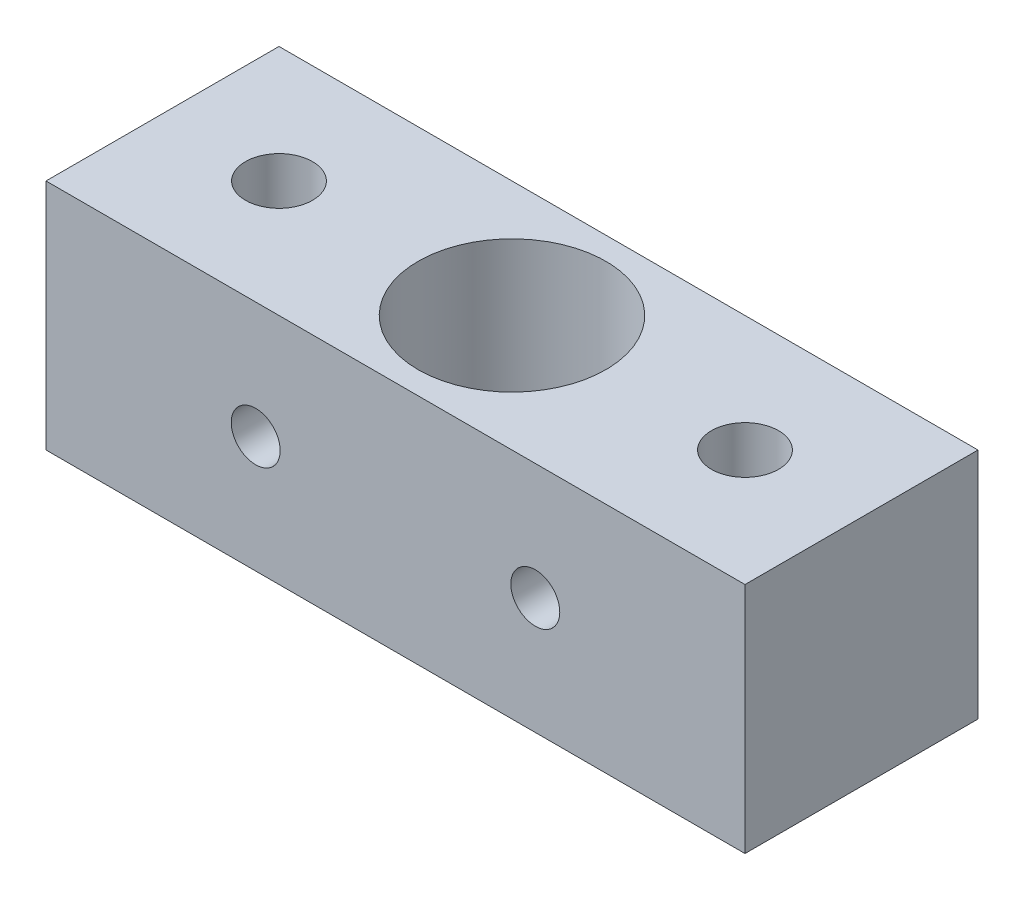
ISO-10303-21;
HEADER;
FILE_DESCRIPTION(('STEP AP214'),'2;1');
FILE_NAME('part.step','',(''),(''),'','','');
FILE_SCHEMA(('AUTOMOTIVE_DESIGN { 1 0 10303 214 1 1 1 1 }'));
ENDSEC;
DATA;
#1=APPLICATION_CONTEXT('core data for automotive mechanical design processes');
#2=APPLICATION_PROTOCOL_DEFINITION('international standard','automotive_design',2000,#1);
#3=PRODUCT_CONTEXT('',#1,'mechanical');
#4=PRODUCT('Part','Part','',(#3));
#5=PRODUCT_RELATED_PRODUCT_CATEGORY('part','',(#4));
#6=PRODUCT_DEFINITION_FORMATION('','',#4);
#7=PRODUCT_DEFINITION_CONTEXT('part definition',#1,'design');
#8=PRODUCT_DEFINITION('design','',#6,#7);
#9=PRODUCT_DEFINITION_SHAPE('','',#8);
#10=(LENGTH_UNIT() NAMED_UNIT(*) SI_UNIT(.MILLI.,.METRE.));
#11=(NAMED_UNIT(*) PLANE_ANGLE_UNIT() SI_UNIT($,.RADIAN.));
#12=(NAMED_UNIT(*) SI_UNIT($,.STERADIAN.) SOLID_ANGLE_UNIT());
#13=UNCERTAINTY_MEASURE_WITH_UNIT(LENGTH_MEASURE(1.E-05),#10,'distance_accuracy_value','');
#14=(GEOMETRIC_REPRESENTATION_CONTEXT(3) GLOBAL_UNCERTAINTY_ASSIGNED_CONTEXT((#13)) GLOBAL_UNIT_ASSIGNED_CONTEXT((#10,
#11,#12)) REPRESENTATION_CONTEXT('',''));
#15=CARTESIAN_POINT('',(0.,0.,0.));
#16=DIRECTION('',(0.,0.,1.));
#17=DIRECTION('',(1.,0.,0.));
#18=AXIS2_PLACEMENT_3D('',#15,#16,#17);
#19=CARTESIAN_POINT('',(19.05,12.7,-6.35));
#20=DIRECTION('',(-1.,0.,0.));
#21=DIRECTION('',(0.,0.,1.));
#22=AXIS2_PLACEMENT_3D('',#19,#20,#21);
#23=PLANE('',#22);
#24=DIRECTION('',(0.,0.,-1.));
#25=VECTOR('',#24,1.);
#26=CARTESIAN_POINT('',(19.05,0.,-6.35));
#27=LINE('',#26,#25);
#28=CARTESIAN_POINT('',(19.05,0.,6.35));
#29=VERTEX_POINT('',#28);
#30=CARTESIAN_POINT('',(19.05,0.,-6.35));
#31=VERTEX_POINT('',#30);
#32=EDGE_CURVE('E97',#29,#31,#27,.T.);
#33=ORIENTED_EDGE('',*,*,#32,.T.);
#34=DIRECTION('',(0.,-1.,0.));
#35=VECTOR('',#34,1.);
#36=CARTESIAN_POINT('',(19.05,12.7,-6.35));
#37=LINE('',#36,#35);
#38=CARTESIAN_POINT('',(19.05,12.7,-6.35));
#39=VERTEX_POINT('',#38);
#40=EDGE_CURVE('E11',#39,#31,#37,.T.);
#41=ORIENTED_EDGE('',*,*,#40,.F.);
#42=DIRECTION('',(0.,0.,-1.));
#43=VECTOR('',#42,1.);
#44=CARTESIAN_POINT('',(19.05,12.7,-6.35));
#45=LINE('',#44,#43);
#46=CARTESIAN_POINT('',(19.05,12.7,6.35));
#47=VERTEX_POINT('',#46);
#48=EDGE_CURVE('E85',#47,#39,#45,.T.);
#49=ORIENTED_EDGE('',*,*,#48,.F.);
#50=DIRECTION('',(0.,-1.,0.));
#51=VECTOR('',#50,1.);
#52=CARTESIAN_POINT('',(19.05,12.7,6.35));
#53=LINE('',#52,#51);
#54=EDGE_CURVE('E93',#47,#29,#53,.T.);
#55=ORIENTED_EDGE('',*,*,#54,.T.);
#56=EDGE_LOOP('',(#33,#41,#49,#55));
#57=FACE_BOUND('',#56,.T.);
#58=ADVANCED_FACE('F34',(#57),#23,.F.);
#59=CARTESIAN_POINT('',(-19.05,12.7,-6.35));
#60=DIRECTION('',(0.,0.,1.));
#61=DIRECTION('',(1.,0.,0.));
#62=AXIS2_PLACEMENT_3D('',#59,#60,#61);
#63=PLANE('',#62);
#64=CARTESIAN_POINT('',(7.62,6.35,-6.35));
#65=DIRECTION('',(0.,0.,1.));
#66=DIRECTION('',(1.,0.,0.));
#67=AXIS2_PLACEMENT_3D('',#64,#65,#66);
#68=CIRCLE('',#67,1.3335);
#69=CARTESIAN_POINT('',(8.9535,6.35,-6.35));
#70=VERTEX_POINT('',#69);
#71=EDGE_CURVE('E115',#70,#70,#68,.T.);
#72=ORIENTED_EDGE('',*,*,#71,.T.);
#73=EDGE_LOOP('',(#72));
#74=FACE_BOUND('',#73,.T.);
#75=CARTESIAN_POINT('',(-7.62,6.35,-6.35));
#76=DIRECTION('',(0.,0.,1.));
#77=DIRECTION('',(1.,0.,0.));
#78=AXIS2_PLACEMENT_3D('',#75,#76,#77);
#79=CIRCLE('',#78,1.3335);
#80=CARTESIAN_POINT('',(-6.2865,6.35,-6.35));
#81=VERTEX_POINT('',#80);
#82=EDGE_CURVE('E129',#81,#81,#79,.T.);
#83=ORIENTED_EDGE('',*,*,#82,.T.);
#84=EDGE_LOOP('',(#83));
#85=FACE_BOUND('',#84,.T.);
#86=DIRECTION('',(-1.,0.,0.));
#87=VECTOR('',#86,1.);
#88=CARTESIAN_POINT('',(-19.05,0.,-6.35));
#89=LINE('',#88,#87);
#90=CARTESIAN_POINT('',(-19.05,0.,-6.35));
#91=VERTEX_POINT('',#90);
#92=EDGE_CURVE('E89',#31,#91,#89,.T.);
#93=ORIENTED_EDGE('',*,*,#92,.T.);
#94=DIRECTION('',(0.,-1.,0.));
#95=VECTOR('',#94,1.);
#96=CARTESIAN_POINT('',(-19.05,12.7,-6.35));
#97=LINE('',#96,#95);
#98=CARTESIAN_POINT('',(-19.05,12.7,-6.35));
#99=VERTEX_POINT('',#98);
#100=EDGE_CURVE('E42',#99,#91,#97,.T.);
#101=ORIENTED_EDGE('',*,*,#100,.F.);
#102=DIRECTION('',(-1.,0.,0.));
#103=VECTOR('',#102,1.);
#104=CARTESIAN_POINT('',(-19.05,12.7,-6.35));
#105=LINE('',#104,#103);
#106=EDGE_CURVE('E80',#39,#99,#105,.T.);
#107=ORIENTED_EDGE('',*,*,#106,.F.);
#108=ORIENTED_EDGE('',*,*,#40,.T.);
#109=EDGE_LOOP('',(#93,#101,#107,#108));
#110=FACE_BOUND('',#109,.T.);
#111=ADVANCED_FACE('F88',(#74,#85,#110),#63,.F.);
#112=CARTESIAN_POINT('',(-19.05,12.7,-6.35));
#113=DIRECTION('',(1.,0.,0.));
#114=DIRECTION('',(0.,0.,-1.));
#115=AXIS2_PLACEMENT_3D('',#112,#113,#114);
#116=PLANE('',#115);
#117=DIRECTION('',(0.,0.,1.));
#118=VECTOR('',#117,1.);
#119=CARTESIAN_POINT('',(-19.05,0.,-6.35));
#120=LINE('',#119,#118);
#121=CARTESIAN_POINT('',(-19.05,0.,6.35));
#122=VERTEX_POINT('',#121);
#123=EDGE_CURVE('E67',#91,#122,#120,.T.);
#124=ORIENTED_EDGE('',*,*,#123,.T.);
#125=DIRECTION('',(0.,-1.,0.));
#126=VECTOR('',#125,1.);
#127=CARTESIAN_POINT('',(-19.05,12.7,6.35));
#128=LINE('',#127,#126);
#129=CARTESIAN_POINT('',(-19.05,12.7,6.35));
#130=VERTEX_POINT('',#129);
#131=EDGE_CURVE('E90',#130,#122,#128,.T.);
#132=ORIENTED_EDGE('',*,*,#131,.F.);
#133=DIRECTION('',(0.,0.,1.));
#134=VECTOR('',#133,1.);
#135=CARTESIAN_POINT('',(-19.05,12.7,-6.35));
#136=LINE('',#135,#134);
#137=EDGE_CURVE('E83',#99,#130,#136,.T.);
#138=ORIENTED_EDGE('',*,*,#137,.F.);
#139=ORIENTED_EDGE('',*,*,#100,.T.);
#140=EDGE_LOOP('',(#124,#132,#138,#139));
#141=FACE_BOUND('',#140,.T.);
#142=ADVANCED_FACE('F91',(#141),#116,.F.);
#143=CARTESIAN_POINT('',(-19.05,12.7,6.35));
#144=DIRECTION('',(0.,0.,-1.));
#145=DIRECTION('',(-1.,0.,0.));
#146=AXIS2_PLACEMENT_3D('',#143,#144,#145);
#147=PLANE('',#146);
#148=CARTESIAN_POINT('',(7.62,6.35,6.35));
#149=DIRECTION('',(0.,0.,1.));
#150=DIRECTION('',(1.,0.,0.));
#151=AXIS2_PLACEMENT_3D('',#148,#149,#150);
#152=CIRCLE('',#151,1.3335);
#153=CARTESIAN_POINT('',(8.9535,6.35,6.35));
#154=VERTEX_POINT('',#153);
#155=EDGE_CURVE('E135',#154,#154,#152,.T.);
#156=ORIENTED_EDGE('',*,*,#155,.F.);
#157=EDGE_LOOP('',(#156));
#158=FACE_BOUND('',#157,.T.);
#159=CARTESIAN_POINT('',(-7.62,6.35,6.35));
#160=DIRECTION('',(0.,0.,1.));
#161=DIRECTION('',(1.,0.,0.));
#162=AXIS2_PLACEMENT_3D('',#159,#160,#161);
#163=CIRCLE('',#162,1.3335);
#164=CARTESIAN_POINT('',(-6.2865,6.35,6.35));
#165=VERTEX_POINT('',#164);
#166=EDGE_CURVE('E132',#165,#165,#163,.T.);
#167=ORIENTED_EDGE('',*,*,#166,.F.);
#168=EDGE_LOOP('',(#167));
#169=FACE_BOUND('',#168,.T.);
#170=DIRECTION('',(1.,0.,0.));
#171=VECTOR('',#170,1.);
#172=CARTESIAN_POINT('',(-19.05,0.,6.35));
#173=LINE('',#172,#171);
#174=EDGE_CURVE('E73',#122,#29,#173,.T.);
#175=ORIENTED_EDGE('',*,*,#174,.T.);
#176=ORIENTED_EDGE('',*,*,#54,.F.);
#177=DIRECTION('',(1.,0.,0.));
#178=VECTOR('',#177,1.);
#179=CARTESIAN_POINT('',(-19.05,12.7,6.35));
#180=LINE('',#179,#178);
#181=EDGE_CURVE('E50',#130,#47,#180,.T.);
#182=ORIENTED_EDGE('',*,*,#181,.F.);
#183=ORIENTED_EDGE('',*,*,#131,.T.);
#184=EDGE_LOOP('',(#175,#176,#182,#183));
#185=FACE_BOUND('',#184,.T.);
#186=ADVANCED_FACE('F105',(#158,#169,#185),#147,.F.);
#187=CARTESIAN_POINT('',(0.,12.7,0.));
#188=DIRECTION('',(0.,1.,0.));
#189=DIRECTION('',(0.,0.,1.));
#190=AXIS2_PLACEMENT_3D('',#187,#188,#189);
#191=PLANE('',#190);
#192=CARTESIAN_POINT('',(12.7,12.7,0.));
#193=DIRECTION('',(0.,1.,0.));
#194=DIRECTION('',(0.,0.,1.));
#195=AXIS2_PLACEMENT_3D('',#192,#193,#194);
#196=CIRCLE('',#195,1.8288);
#197=CARTESIAN_POINT('',(12.7,12.7,1.8288));
#198=VERTEX_POINT('',#197);
#199=EDGE_CURVE('E124',#198,#198,#196,.T.);
#200=ORIENTED_EDGE('',*,*,#199,.F.);
#201=EDGE_LOOP('',(#200));
#202=FACE_BOUND('',#201,.T.);
#203=CARTESIAN_POINT('',(0.,12.7,0.));
#204=DIRECTION('',(0.,1.,0.));
#205=DIRECTION('',(0.,0.,1.));
#206=AXIS2_PLACEMENT_3D('',#203,#204,#205);
#207=CIRCLE('',#206,5.1181);
#208=CARTESIAN_POINT('',(0.,12.7,5.1181));
#209=VERTEX_POINT('',#208);
#210=EDGE_CURVE('E121',#209,#209,#207,.T.);
#211=ORIENTED_EDGE('',*,*,#210,.F.);
#212=EDGE_LOOP('',(#211));
#213=FACE_BOUND('',#212,.T.);
#214=CARTESIAN_POINT('',(-12.7,12.7,0.));
#215=DIRECTION('',(0.,1.,0.));
#216=DIRECTION('',(0.,0.,1.));
#217=AXIS2_PLACEMENT_3D('',#214,#215,#216);
#218=CIRCLE('',#217,1.8288);
#219=CARTESIAN_POINT('',(-12.7,12.7,1.8288));
#220=VERTEX_POINT('',#219);
#221=EDGE_CURVE('E114',#220,#220,#218,.T.);
#222=ORIENTED_EDGE('',*,*,#221,.F.);
#223=EDGE_LOOP('',(#222));
#224=FACE_BOUND('',#223,.T.);
#225=ORIENTED_EDGE('',*,*,#48,.T.);
#226=ORIENTED_EDGE('',*,*,#106,.T.);
#227=ORIENTED_EDGE('',*,*,#137,.T.);
#228=ORIENTED_EDGE('',*,*,#181,.T.);
#229=EDGE_LOOP('',(#225,#226,#227,#228));
#230=FACE_BOUND('',#229,.T.);
#231=ADVANCED_FACE('F81',(#202,#213,#224,#230),#191,.T.);
#232=CARTESIAN_POINT('',(0.,0.,0.));
#233=DIRECTION('',(0.,1.,0.));
#234=DIRECTION('',(0.,0.,1.));
#235=AXIS2_PLACEMENT_3D('',#232,#233,#234);
#236=PLANE('',#235);
#237=CARTESIAN_POINT('',(12.7,0.,0.));
#238=DIRECTION('',(0.,1.,0.));
#239=DIRECTION('',(0.,0.,1.));
#240=AXIS2_PLACEMENT_3D('',#237,#238,#239);
#241=CIRCLE('',#240,1.8288);
#242=CARTESIAN_POINT('',(12.7,0.,1.8288));
#243=VERTEX_POINT('',#242);
#244=EDGE_CURVE('E100',#243,#243,#241,.T.);
#245=ORIENTED_EDGE('',*,*,#244,.T.);
#246=EDGE_LOOP('',(#245));
#247=FACE_BOUND('',#246,.T.);
#248=CARTESIAN_POINT('',(0.,0.,0.));
#249=DIRECTION('',(0.,1.,0.));
#250=DIRECTION('',(0.,0.,1.));
#251=AXIS2_PLACEMENT_3D('',#248,#249,#250);
#252=CIRCLE('',#251,5.1181);
#253=CARTESIAN_POINT('',(0.,0.,5.1181));
#254=VERTEX_POINT('',#253);
#255=EDGE_CURVE('E118',#254,#254,#252,.T.);
#256=ORIENTED_EDGE('',*,*,#255,.T.);
#257=EDGE_LOOP('',(#256));
#258=FACE_BOUND('',#257,.T.);
#259=CARTESIAN_POINT('',(-12.7,0.,0.));
#260=DIRECTION('',(0.,1.,0.));
#261=DIRECTION('',(0.,0.,1.));
#262=AXIS2_PLACEMENT_3D('',#259,#260,#261);
#263=CIRCLE('',#262,1.8288);
#264=CARTESIAN_POINT('',(-12.7,0.,1.8288));
#265=VERTEX_POINT('',#264);
#266=EDGE_CURVE('E111',#265,#265,#263,.T.);
#267=ORIENTED_EDGE('',*,*,#266,.T.);
#268=EDGE_LOOP('',(#267));
#269=FACE_BOUND('',#268,.T.);
#270=ORIENTED_EDGE('',*,*,#32,.F.);
#271=ORIENTED_EDGE('',*,*,#174,.F.);
#272=ORIENTED_EDGE('',*,*,#123,.F.);
#273=ORIENTED_EDGE('',*,*,#92,.F.);
#274=EDGE_LOOP('',(#270,#271,#272,#273));
#275=FACE_BOUND('',#274,.T.);
#276=ADVANCED_FACE('F108',(#247,#258,#269,#275),#236,.F.);
#277=CARTESIAN_POINT('',(-12.7,0.,0.));
#278=DIRECTION('',(0.,1.,0.));
#279=DIRECTION('',(0.,0.,1.));
#280=AXIS2_PLACEMENT_3D('',#277,#278,#279);
#281=CYLINDRICAL_SURFACE('',#280,1.8288);
#282=ORIENTED_EDGE('',*,*,#266,.F.);
#283=EDGE_LOOP('',(#282));
#284=FACE_BOUND('',#283,.T.);
#285=ORIENTED_EDGE('',*,*,#221,.T.);
#286=EDGE_LOOP('',(#285));
#287=FACE_BOUND('',#286,.T.);
#288=ADVANCED_FACE('F177',(#284,#287),#281,.F.);
#289=CARTESIAN_POINT('',(0.,0.,0.));
#290=DIRECTION('',(0.,1.,0.));
#291=DIRECTION('',(0.,0.,1.));
#292=AXIS2_PLACEMENT_3D('',#289,#290,#291);
#293=CYLINDRICAL_SURFACE('',#292,5.1181);
#294=ORIENTED_EDGE('',*,*,#255,.F.);
#295=EDGE_LOOP('',(#294));
#296=FACE_BOUND('',#295,.T.);
#297=ORIENTED_EDGE('',*,*,#210,.T.);
#298=EDGE_LOOP('',(#297));
#299=FACE_BOUND('',#298,.T.);
#300=ADVANCED_FACE('F162',(#296,#299),#293,.F.);
#301=CARTESIAN_POINT('',(12.7,0.,0.));
#302=DIRECTION('',(0.,1.,0.));
#303=DIRECTION('',(0.,0.,1.));
#304=AXIS2_PLACEMENT_3D('',#301,#302,#303);
#305=CYLINDRICAL_SURFACE('',#304,1.8288);
#306=ORIENTED_EDGE('',*,*,#244,.F.);
#307=EDGE_LOOP('',(#306));
#308=FACE_BOUND('',#307,.T.);
#309=ORIENTED_EDGE('',*,*,#199,.T.);
#310=EDGE_LOOP('',(#309));
#311=FACE_BOUND('',#310,.T.);
#312=ADVANCED_FACE('F156',(#308,#311),#305,.F.);
#313=CARTESIAN_POINT('',(-7.62,6.35,-6.35));
#314=DIRECTION('',(0.,0.,1.));
#315=DIRECTION('',(1.,0.,0.));
#316=AXIS2_PLACEMENT_3D('',#313,#314,#315);
#317=CYLINDRICAL_SURFACE('',#316,1.3335);
#318=ORIENTED_EDGE('',*,*,#82,.F.);
#319=EDGE_LOOP('',(#318));
#320=FACE_BOUND('',#319,.T.);
#321=ORIENTED_EDGE('',*,*,#166,.T.);
#322=EDGE_LOOP('',(#321));
#323=FACE_BOUND('',#322,.T.);
#324=ADVANCED_FACE('F146',(#320,#323),#317,.F.);
#325=CARTESIAN_POINT('',(7.62,6.35,-6.35));
#326=DIRECTION('',(0.,0.,1.));
#327=DIRECTION('',(1.,0.,0.));
#328=AXIS2_PLACEMENT_3D('',#325,#326,#327);
#329=CYLINDRICAL_SURFACE('',#328,1.3335);
#330=ORIENTED_EDGE('',*,*,#71,.F.);
#331=EDGE_LOOP('',(#330));
#332=FACE_BOUND('',#331,.T.);
#333=ORIENTED_EDGE('',*,*,#155,.T.);
#334=EDGE_LOOP('',(#333));
#335=FACE_BOUND('',#334,.T.);
#336=ADVANCED_FACE('F143',(#332,#335),#329,.F.);
#337=CLOSED_SHELL('',(#58,#111,#142,#186,#231,#276,#288,#300,#312,#324,#336));
#338=MANIFOLD_SOLID_BREP('B2',#337);
#339=ADVANCED_BREP_SHAPE_REPRESENTATION('',(#18,#338),#14);
#340=SHAPE_DEFINITION_REPRESENTATION(#9,#339);
ENDSEC;
END-ISO-10303-21;
